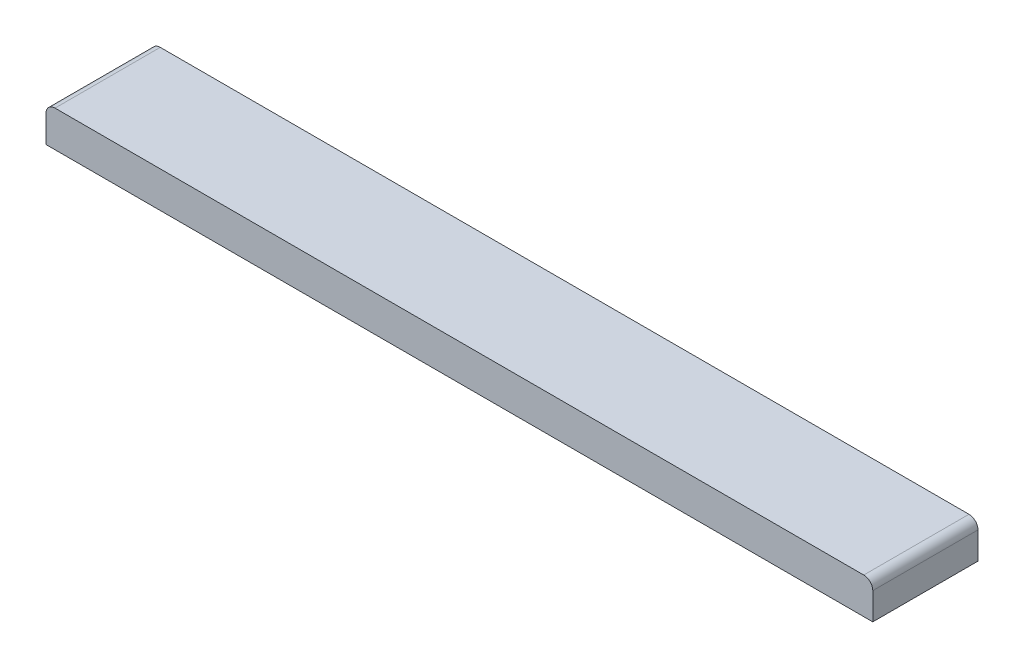
ISO-10303-21;
HEADER;
FILE_DESCRIPTION(('STEP AP214'),'2;1');
FILE_NAME('part.step','',(''),(''),'','','');
FILE_SCHEMA(('AUTOMOTIVE_DESIGN { 1 0 10303 214 1 1 1 1 }'));
ENDSEC;
DATA;
#1=APPLICATION_CONTEXT('core data for automotive mechanical design processes');
#2=APPLICATION_PROTOCOL_DEFINITION('international standard','automotive_design',2000,#1);
#3=PRODUCT_CONTEXT('',#1,'mechanical');
#4=PRODUCT('Part','Part','',(#3));
#5=PRODUCT_RELATED_PRODUCT_CATEGORY('part','',(#4));
#6=PRODUCT_DEFINITION_FORMATION('','',#4);
#7=PRODUCT_DEFINITION_CONTEXT('part definition',#1,'design');
#8=PRODUCT_DEFINITION('design','',#6,#7);
#9=PRODUCT_DEFINITION_SHAPE('','',#8);
#10=(LENGTH_UNIT() NAMED_UNIT(*) SI_UNIT(.MILLI.,.METRE.));
#11=(NAMED_UNIT(*) PLANE_ANGLE_UNIT() SI_UNIT($,.RADIAN.));
#12=(NAMED_UNIT(*) SI_UNIT($,.STERADIAN.) SOLID_ANGLE_UNIT());
#13=UNCERTAINTY_MEASURE_WITH_UNIT(LENGTH_MEASURE(1.E-05),#10,'distance_accuracy_value','');
#14=(GEOMETRIC_REPRESENTATION_CONTEXT(3) GLOBAL_UNCERTAINTY_ASSIGNED_CONTEXT((#13)) GLOBAL_UNIT_ASSIGNED_CONTEXT((#10,
#11,#12)) REPRESENTATION_CONTEXT('',''));
#15=CARTESIAN_POINT('',(0.,0.,0.));
#16=DIRECTION('',(0.,0.,1.));
#17=DIRECTION('',(1.,0.,0.));
#18=AXIS2_PLACEMENT_3D('',#15,#16,#17);
#19=CARTESIAN_POINT('',(137.5,12.,17.5));
#20=DIRECTION('',(-1.,0.,0.));
#21=DIRECTION('',(0.,0.,1.));
#22=AXIS2_PLACEMENT_3D('',#19,#20,#21);
#23=PLANE('',#22);
#24=DIRECTION('',(0.,-1.,0.));
#25=VECTOR('',#24,1.);
#26=CARTESIAN_POINT('',(137.5,12.,-17.5));
#27=LINE('',#26,#25);
#28=CARTESIAN_POINT('',(137.5,9.,-17.5));
#29=VERTEX_POINT('',#28);
#30=CARTESIAN_POINT('',(137.5,0.,-17.5));
#31=VERTEX_POINT('',#30);
#32=EDGE_CURVE('E88',#29,#31,#27,.T.);
#33=ORIENTED_EDGE('',*,*,#32,.F.);
#34=DIRECTION('',(0.,0.,-1.));
#35=VECTOR('',#34,1.);
#36=CARTESIAN_POINT('',(137.5,9.,17.5));
#37=LINE('',#36,#35);
#38=CARTESIAN_POINT('',(137.5,9.,17.5));
#39=VERTEX_POINT('',#38);
#40=EDGE_CURVE('E11',#29,#39,#37,.F.);
#41=ORIENTED_EDGE('',*,*,#40,.T.);
#42=DIRECTION('',(0.,-1.,0.));
#43=VECTOR('',#42,1.);
#44=CARTESIAN_POINT('',(137.5,12.,17.5));
#45=LINE('',#44,#43);
#46=CARTESIAN_POINT('',(137.5,0.,17.5));
#47=VERTEX_POINT('',#46);
#48=EDGE_CURVE('E108',#39,#47,#45,.T.);
#49=ORIENTED_EDGE('',*,*,#48,.T.);
#50=DIRECTION('',(0.,0.,-1.));
#51=VECTOR('',#50,1.);
#52=CARTESIAN_POINT('',(137.5,0.,17.5));
#53=LINE('',#52,#51);
#54=EDGE_CURVE('E103',#47,#31,#53,.T.);
#55=ORIENTED_EDGE('',*,*,#54,.T.);
#56=EDGE_LOOP('',(#33,#41,#49,#55));
#57=FACE_BOUND('',#56,.T.);
#58=ADVANCED_FACE('F37',(#57),#23,.F.);
#59=CARTESIAN_POINT('',(-137.5,12.,-17.5));
#60=DIRECTION('',(0.,0.,1.));
#61=DIRECTION('',(1.,0.,0.));
#62=AXIS2_PLACEMENT_3D('',#59,#60,#61);
#63=PLANE('',#62);
#64=DIRECTION('',(0.,-1.,0.));
#65=VECTOR('',#64,1.);
#66=CARTESIAN_POINT('',(-137.5,12.,-17.5));
#67=LINE('',#66,#65);
#68=CARTESIAN_POINT('',(-137.5,9.,-17.5));
#69=VERTEX_POINT('',#68);
#70=CARTESIAN_POINT('',(-137.5,0.,-17.5));
#71=VERTEX_POINT('',#70);
#72=EDGE_CURVE('E97',#69,#71,#67,.T.);
#73=ORIENTED_EDGE('',*,*,#72,.F.);
#74=CARTESIAN_POINT('',(-134.5,9.,-17.5));
#75=DIRECTION('',(0.,0.,1.));
#76=DIRECTION('',(1.,0.,0.));
#77=AXIS2_PLACEMENT_3D('',#74,#75,#76);
#78=CIRCLE('',#77,3.);
#79=CARTESIAN_POINT('',(-134.5,12.,-17.5));
#80=VERTEX_POINT('',#79);
#81=EDGE_CURVE('E45',#69,#80,#78,.F.);
#82=ORIENTED_EDGE('',*,*,#81,.T.);
#83=DIRECTION('',(-1.,0.,0.));
#84=VECTOR('',#83,1.);
#85=CARTESIAN_POINT('',(-137.5,12.,-17.5));
#86=LINE('',#85,#84);
#87=CARTESIAN_POINT('',(134.5,12.,-17.5));
#88=VERTEX_POINT('',#87);
#89=EDGE_CURVE('E118',#88,#80,#86,.T.);
#90=ORIENTED_EDGE('',*,*,#89,.F.);
#91=CARTESIAN_POINT('',(134.5,9.,-17.5));
#92=DIRECTION('',(0.,0.,1.));
#93=DIRECTION('',(1.,0.,0.));
#94=AXIS2_PLACEMENT_3D('',#91,#92,#93);
#95=CIRCLE('',#94,3.);
#96=EDGE_CURVE('E52',#88,#29,#95,.F.);
#97=ORIENTED_EDGE('',*,*,#96,.T.);
#98=ORIENTED_EDGE('',*,*,#32,.T.);
#99=DIRECTION('',(-1.,0.,0.));
#100=VECTOR('',#99,1.);
#101=CARTESIAN_POINT('',(-137.5,0.,-17.5));
#102=LINE('',#101,#100);
#103=EDGE_CURVE('E91',#31,#71,#102,.T.);
#104=ORIENTED_EDGE('',*,*,#103,.T.);
#105=EDGE_LOOP('',(#73,#82,#90,#97,#98,#104));
#106=FACE_BOUND('',#105,.T.);
#107=ADVANCED_FACE('F90',(#106),#63,.F.);
#108=CARTESIAN_POINT('',(-137.5,12.,17.5));
#109=DIRECTION('',(1.,0.,0.));
#110=DIRECTION('',(0.,0.,-1.));
#111=AXIS2_PLACEMENT_3D('',#108,#109,#110);
#112=PLANE('',#111);
#113=DIRECTION('',(0.,-1.,0.));
#114=VECTOR('',#113,1.);
#115=CARTESIAN_POINT('',(-137.5,12.,17.5));
#116=LINE('',#115,#114);
#117=CARTESIAN_POINT('',(-137.5,9.,17.5));
#118=VERTEX_POINT('',#117);
#119=CARTESIAN_POINT('',(-137.5,0.,17.5));
#120=VERTEX_POINT('',#119);
#121=EDGE_CURVE('E120',#118,#120,#116,.T.);
#122=ORIENTED_EDGE('',*,*,#121,.F.);
#123=DIRECTION('',(0.,0.,1.));
#124=VECTOR('',#123,1.);
#125=CARTESIAN_POINT('',(-137.5,9.,17.5));
#126=LINE('',#125,#124);
#127=EDGE_CURVE('E60',#118,#69,#126,.F.);
#128=ORIENTED_EDGE('',*,*,#127,.T.);
#129=ORIENTED_EDGE('',*,*,#72,.T.);
#130=DIRECTION('',(0.,0.,1.));
#131=VECTOR('',#130,1.);
#132=CARTESIAN_POINT('',(-137.5,0.,17.5));
#133=LINE('',#132,#131);
#134=EDGE_CURVE('E105',#71,#120,#133,.T.);
#135=ORIENTED_EDGE('',*,*,#134,.T.);
#136=EDGE_LOOP('',(#122,#128,#129,#135));
#137=FACE_BOUND('',#136,.T.);
#138=ADVANCED_FACE('F145',(#137),#112,.F.);
#139=CARTESIAN_POINT('',(-137.5,12.,17.5));
#140=DIRECTION('',(0.,0.,-1.));
#141=DIRECTION('',(-1.,0.,0.));
#142=AXIS2_PLACEMENT_3D('',#139,#140,#141);
#143=PLANE('',#142);
#144=DIRECTION('',(1.,0.,0.));
#145=VECTOR('',#144,1.);
#146=CARTESIAN_POINT('',(-137.5,12.,17.5));
#147=LINE('',#146,#145);
#148=CARTESIAN_POINT('',(-134.5,12.,17.5));
#149=VERTEX_POINT('',#148);
#150=CARTESIAN_POINT('',(134.5,12.,17.5));
#151=VERTEX_POINT('',#150);
#152=EDGE_CURVE('E112',#149,#151,#147,.T.);
#153=ORIENTED_EDGE('',*,*,#152,.F.);
#154=CARTESIAN_POINT('',(-134.5,9.,17.5));
#155=DIRECTION('',(0.,0.,-1.));
#156=DIRECTION('',(-1.,0.,0.));
#157=AXIS2_PLACEMENT_3D('',#154,#155,#156);
#158=CIRCLE('',#157,3.);
#159=EDGE_CURVE('E130',#149,#118,#158,.F.);
#160=ORIENTED_EDGE('',*,*,#159,.T.);
#161=ORIENTED_EDGE('',*,*,#121,.T.);
#162=DIRECTION('',(1.,0.,0.));
#163=VECTOR('',#162,1.);
#164=CARTESIAN_POINT('',(-137.5,0.,17.5));
#165=LINE('',#164,#163);
#166=EDGE_CURVE('E116',#120,#47,#165,.T.);
#167=ORIENTED_EDGE('',*,*,#166,.T.);
#168=ORIENTED_EDGE('',*,*,#48,.F.);
#169=CARTESIAN_POINT('',(134.5,9.,17.5));
#170=DIRECTION('',(0.,0.,-1.));
#171=DIRECTION('',(-1.,0.,0.));
#172=AXIS2_PLACEMENT_3D('',#169,#170,#171);
#173=CIRCLE('',#172,3.);
#174=EDGE_CURVE('E128',#39,#151,#173,.F.);
#175=ORIENTED_EDGE('',*,*,#174,.T.);
#176=EDGE_LOOP('',(#153,#160,#161,#167,#168,#175));
#177=FACE_BOUND('',#176,.T.);
#178=ADVANCED_FACE('F144',(#177),#143,.F.);
#179=CARTESIAN_POINT('',(0.,12.,0.));
#180=DIRECTION('',(0.,-1.,0.));
#181=DIRECTION('',(0.,0.,-1.));
#182=AXIS2_PLACEMENT_3D('',#179,#180,#181);
#183=PLANE('',#182);
#184=ORIENTED_EDGE('',*,*,#89,.T.);
#185=DIRECTION('',(0.,0.,1.));
#186=VECTOR('',#185,1.);
#187=CARTESIAN_POINT('',(-134.5,12.,0.));
#188=LINE('',#187,#186);
#189=EDGE_CURVE('E125',#80,#149,#188,.T.);
#190=ORIENTED_EDGE('',*,*,#189,.T.);
#191=ORIENTED_EDGE('',*,*,#152,.T.);
#192=DIRECTION('',(0.,0.,-1.));
#193=VECTOR('',#192,1.);
#194=CARTESIAN_POINT('',(134.5,12.,0.));
#195=LINE('',#194,#193);
#196=EDGE_CURVE('E96',#151,#88,#195,.T.);
#197=ORIENTED_EDGE('',*,*,#196,.T.);
#198=EDGE_LOOP('',(#184,#190,#191,#197));
#199=FACE_BOUND('',#198,.T.);
#200=ADVANCED_FACE('F138',(#199),#183,.F.);
#201=CARTESIAN_POINT('',(0.,0.,0.));
#202=DIRECTION('',(0.,-1.,0.));
#203=DIRECTION('',(0.,0.,-1.));
#204=AXIS2_PLACEMENT_3D('',#201,#202,#203);
#205=PLANE('',#204);
#206=ORIENTED_EDGE('',*,*,#54,.F.);
#207=ORIENTED_EDGE('',*,*,#166,.F.);
#208=ORIENTED_EDGE('',*,*,#134,.F.);
#209=ORIENTED_EDGE('',*,*,#103,.F.);
#210=EDGE_LOOP('',(#206,#207,#208,#209));
#211=FACE_BOUND('',#210,.T.);
#212=ADVANCED_FACE('F101',(#211),#205,.T.);
#213=CARTESIAN_POINT('',(-134.5,9.,0.));
#214=DIRECTION('',(0.,0.,1.));
#215=DIRECTION('',(1.,0.,0.));
#216=AXIS2_PLACEMENT_3D('',#213,#214,#215);
#217=CYLINDRICAL_SURFACE('',#216,3.);
#218=ORIENTED_EDGE('',*,*,#81,.F.);
#219=ORIENTED_EDGE('',*,*,#127,.F.);
#220=ORIENTED_EDGE('',*,*,#159,.F.);
#221=ORIENTED_EDGE('',*,*,#189,.F.);
#222=EDGE_LOOP('',(#218,#219,#220,#221));
#223=FACE_BOUND('',#222,.T.);
#224=ADVANCED_FACE('F142',(#223),#217,.T.);
#225=CARTESIAN_POINT('',(134.5,9.,0.));
#226=DIRECTION('',(0.,0.,-1.));
#227=DIRECTION('',(-1.,0.,0.));
#228=AXIS2_PLACEMENT_3D('',#225,#226,#227);
#229=CYLINDRICAL_SURFACE('',#228,3.);
#230=ORIENTED_EDGE('',*,*,#174,.F.);
#231=ORIENTED_EDGE('',*,*,#40,.F.);
#232=ORIENTED_EDGE('',*,*,#96,.F.);
#233=ORIENTED_EDGE('',*,*,#196,.F.);
#234=EDGE_LOOP('',(#230,#231,#232,#233));
#235=FACE_BOUND('',#234,.T.);
#236=ADVANCED_FACE('F39',(#235),#229,.T.);
#237=CLOSED_SHELL('',(#58,#107,#138,#178,#200,#212,#224,#236));
#238=MANIFOLD_SOLID_BREP('B2',#237);
#239=ADVANCED_BREP_SHAPE_REPRESENTATION('',(#18,#238),#14);
#240=SHAPE_DEFINITION_REPRESENTATION(#9,#239);
ENDSEC;
END-ISO-10303-21;
